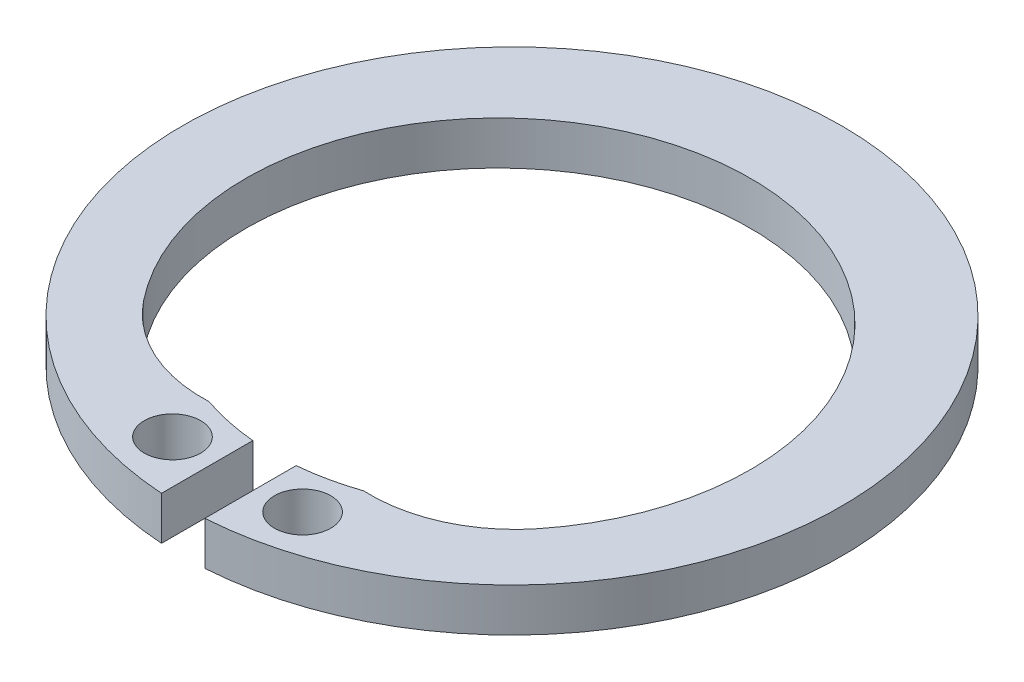
ISO-10303-21;
HEADER;
FILE_DESCRIPTION(('STEP AP214'),'2;1');
FILE_NAME('part.step','',(''),(''),'','','');
FILE_SCHEMA(('AUTOMOTIVE_DESIGN { 1 0 10303 214 1 1 1 1 }'));
ENDSEC;
DATA;
#1=APPLICATION_CONTEXT('core data for automotive mechanical design processes');
#2=APPLICATION_PROTOCOL_DEFINITION('international standard','automotive_design',2000,#1);
#3=PRODUCT_CONTEXT('',#1,'mechanical');
#4=PRODUCT('Part','Part','',(#3));
#5=PRODUCT_RELATED_PRODUCT_CATEGORY('part','',(#4));
#6=PRODUCT_DEFINITION_FORMATION('','',#4);
#7=PRODUCT_DEFINITION_CONTEXT('part definition',#1,'design');
#8=PRODUCT_DEFINITION('design','',#6,#7);
#9=PRODUCT_DEFINITION_SHAPE('','',#8);
#10=(LENGTH_UNIT() NAMED_UNIT(*) SI_UNIT(.MILLI.,.METRE.));
#11=(NAMED_UNIT(*) PLANE_ANGLE_UNIT() SI_UNIT($,.RADIAN.));
#12=(NAMED_UNIT(*) SI_UNIT($,.STERADIAN.) SOLID_ANGLE_UNIT());
#13=UNCERTAINTY_MEASURE_WITH_UNIT(LENGTH_MEASURE(1.E-05),#10,'distance_accuracy_value','');
#14=(GEOMETRIC_REPRESENTATION_CONTEXT(3) GLOBAL_UNCERTAINTY_ASSIGNED_CONTEXT((#13)) GLOBAL_UNIT_ASSIGNED_CONTEXT((#10,
#11,#12)) REPRESENTATION_CONTEXT('',''));
#15=CARTESIAN_POINT('',(0.,0.,0.));
#16=DIRECTION('',(0.,0.,1.));
#17=DIRECTION('',(1.,0.,0.));
#18=AXIS2_PLACEMENT_3D('',#15,#16,#17);
#19=CARTESIAN_POINT('',(0.,1.,0.));
#20=DIRECTION('',(0.,-1.,0.));
#21=DIRECTION('',(0.,0.,-1.));
#22=AXIS2_PLACEMENT_3D('',#19,#20,#21);
#23=PLANE('',#22);
#24=CARTESIAN_POINT('',(0.,1.,0.));
#25=DIRECTION('',(0.,1.,0.));
#26=DIRECTION('',(0.,0.,-1.));
#27=AXIS2_PLACEMENT_3D('',#24,#25,#26);
#28=CIRCLE('',#27,7.6);
#29=CARTESIAN_POINT('',(0.500000000000001,1.,7.58353479585872));
#30=VERTEX_POINT('',#29);
#31=CARTESIAN_POINT('',(-0.499999999999999,1.,7.58353479585872));
#32=VERTEX_POINT('',#31);
#33=EDGE_CURVE('E145',#30,#32,#28,.T.);
#34=ORIENTED_EDGE('',*,*,#33,.T.);
#35=DIRECTION('',(0.,0.,-1.));
#36=VECTOR('',#35,1.);
#37=CARTESIAN_POINT('',(-0.499999999999999,1.,7.58353479585872));
#38=LINE('',#37,#36);
#39=CARTESIAN_POINT('',(-0.499999999999999,1.,5.47722557505166));
#40=VERTEX_POINT('',#39);
#41=EDGE_CURVE('E93',#32,#40,#38,.T.);
#42=ORIENTED_EDGE('',*,*,#41,.T.);
#43=CARTESIAN_POINT('',(0.,1.,0.));
#44=DIRECTION('',(0.,-1.,0.));
#45=DIRECTION('',(0.,0.,-1.));
#46=AXIS2_PLACEMENT_3D('',#43,#44,#45);
#47=CIRCLE('',#46,5.5);
#48=CARTESIAN_POINT('',(-1.78055613261314,1.,5.20380820732411));
#49=VERTEX_POINT('',#48);
#50=EDGE_CURVE('E160',#40,#49,#47,.T.);
#51=ORIENTED_EDGE('',*,*,#50,.T.);
#52=CARTESIAN_POINT('',(-1.93130134611594,1.,1.85615336840999));
#53=DIRECTION('',(0.,-1.,0.));
#54=DIRECTION('',(0.,0.,1.));
#55=AXIS2_PLACEMENT_3D('',#52,#53,#54);
#56=CIRCLE('',#55,3.35104715572596);
#57=CARTESIAN_POINT('',(-4.5534080353056,1.,3.94279506031733));
#58=VERTEX_POINT('',#57);
#59=EDGE_CURVE('E173',#49,#58,#56,.T.);
#60=ORIENTED_EDGE('',*,*,#59,.T.);
#61=CARTESIAN_POINT('',(0.,1.,0.319246451137412));
#62=DIRECTION('',(0.,-1.,0.));
#63=DIRECTION('',(0.,0.,-1.));
#64=AXIS2_PLACEMENT_3D('',#61,#62,#63);
#65=CIRCLE('',#64,5.81924645113741);
#66=CARTESIAN_POINT('',(4.5534080353056,1.,3.94279506031733));
#67=VERTEX_POINT('',#66);
#68=EDGE_CURVE('E112',#58,#67,#65,.T.);
#69=ORIENTED_EDGE('',*,*,#68,.T.);
#70=CARTESIAN_POINT('',(1.93130134611594,1.,1.85615336840999));
#71=DIRECTION('',(0.,-1.,0.));
#72=DIRECTION('',(0.,0.,-1.));
#73=AXIS2_PLACEMENT_3D('',#70,#71,#72);
#74=CIRCLE('',#73,3.35104715572596);
#75=CARTESIAN_POINT('',(1.78055613261314,1.,5.20380820732411));
#76=VERTEX_POINT('',#75);
#77=EDGE_CURVE('E106',#67,#76,#74,.T.);
#78=ORIENTED_EDGE('',*,*,#77,.T.);
#79=CARTESIAN_POINT('',(0.,1.,0.));
#80=DIRECTION('',(0.,-1.,0.));
#81=DIRECTION('',(0.,0.,1.));
#82=AXIS2_PLACEMENT_3D('',#79,#80,#81);
#83=CIRCLE('',#82,5.5);
#84=CARTESIAN_POINT('',(0.5,1.,5.47722557505166));
#85=VERTEX_POINT('',#84);
#86=EDGE_CURVE('E110',#76,#85,#83,.T.);
#87=ORIENTED_EDGE('',*,*,#86,.T.);
#88=DIRECTION('',(0.,0.,1.));
#89=VECTOR('',#88,1.);
#90=CARTESIAN_POINT('',(0.500000000000001,1.,7.58353479585872));
#91=LINE('',#90,#89);
#92=EDGE_CURVE('E50',#85,#30,#91,.T.);
#93=ORIENTED_EDGE('',*,*,#92,.T.);
#94=EDGE_LOOP('',(#34,#42,#51,#60,#69,#78,#87,#93));
#95=FACE_BOUND('',#94,.T.);
#96=CARTESIAN_POINT('',(-1.5,1.,6.32958885700515));
#97=DIRECTION('',(0.,1.,0.));
#98=DIRECTION('',(0.,0.,1.));
#99=AXIS2_PLACEMENT_3D('',#96,#97,#98);
#100=CIRCLE('',#99,0.65);
#101=CARTESIAN_POINT('',(-1.5,1.,6.97958885700515));
#102=VERTEX_POINT('',#101);
#103=EDGE_CURVE('E134',#102,#102,#100,.T.);
#104=ORIENTED_EDGE('',*,*,#103,.F.);
#105=EDGE_LOOP('',(#104));
#106=FACE_BOUND('',#105,.T.);
#107=CARTESIAN_POINT('',(1.5,1.,6.32958885700515));
#108=DIRECTION('',(0.,1.,0.));
#109=DIRECTION('',(0.,0.,-1.));
#110=AXIS2_PLACEMENT_3D('',#107,#108,#109);
#111=CIRCLE('',#110,0.650000000000001);
#112=CARTESIAN_POINT('',(1.5,1.,5.67958885700515));
#113=VERTEX_POINT('',#112);
#114=EDGE_CURVE('E182',#113,#113,#111,.T.);
#115=ORIENTED_EDGE('',*,*,#114,.F.);
#116=EDGE_LOOP('',(#115));
#117=FACE_BOUND('',#116,.T.);
#118=ADVANCED_FACE('F33',(#95,#106,#117),#23,.F.);
#119=CARTESIAN_POINT('',(0.,0.,0.));
#120=DIRECTION('',(0.,-1.,0.));
#121=DIRECTION('',(0.,0.,-1.));
#122=AXIS2_PLACEMENT_3D('',#119,#120,#121);
#123=PLANE('',#122);
#124=CARTESIAN_POINT('',(-1.5,0.,6.32958885700515));
#125=DIRECTION('',(0.,1.,0.));
#126=DIRECTION('',(0.,0.,1.));
#127=AXIS2_PLACEMENT_3D('',#124,#125,#126);
#128=CIRCLE('',#127,0.65);
#129=CARTESIAN_POINT('',(-1.5,0.,6.97958885700515));
#130=VERTEX_POINT('',#129);
#131=EDGE_CURVE('E179',#130,#130,#128,.T.);
#132=ORIENTED_EDGE('',*,*,#131,.T.);
#133=EDGE_LOOP('',(#132));
#134=FACE_BOUND('',#133,.T.);
#135=CARTESIAN_POINT('',(0.,0.,0.));
#136=DIRECTION('',(0.,1.,0.));
#137=DIRECTION('',(0.,0.,-1.));
#138=AXIS2_PLACEMENT_3D('',#135,#136,#137);
#139=CIRCLE('',#138,7.6);
#140=CARTESIAN_POINT('',(0.500000000000001,0.,7.58353479585872));
#141=VERTEX_POINT('',#140);
#142=CARTESIAN_POINT('',(-0.499999999999999,0.,7.58353479585872));
#143=VERTEX_POINT('',#142);
#144=EDGE_CURVE('E130',#141,#143,#139,.T.);
#145=ORIENTED_EDGE('',*,*,#144,.F.);
#146=DIRECTION('',(0.,0.,1.));
#147=VECTOR('',#146,1.);
#148=CARTESIAN_POINT('',(0.500000000000001,0.,7.58353479585872));
#149=LINE('',#148,#147);
#150=CARTESIAN_POINT('',(0.5,0.,5.47722557505166));
#151=VERTEX_POINT('',#150);
#152=EDGE_CURVE('E85',#151,#141,#149,.T.);
#153=ORIENTED_EDGE('',*,*,#152,.F.);
#154=CARTESIAN_POINT('',(0.,0.,0.));
#155=DIRECTION('',(0.,-1.,0.));
#156=DIRECTION('',(0.,0.,1.));
#157=AXIS2_PLACEMENT_3D('',#154,#155,#156);
#158=CIRCLE('',#157,5.5);
#159=CARTESIAN_POINT('',(1.78055613261314,0.,5.20380820732411));
#160=VERTEX_POINT('',#159);
#161=EDGE_CURVE('E79',#160,#151,#158,.T.);
#162=ORIENTED_EDGE('',*,*,#161,.F.);
#163=CARTESIAN_POINT('',(1.93130134611594,0.,1.85615336840999));
#164=DIRECTION('',(0.,-1.,0.));
#165=DIRECTION('',(0.,0.,-1.));
#166=AXIS2_PLACEMENT_3D('',#163,#164,#165);
#167=CIRCLE('',#166,3.35104715572596);
#168=CARTESIAN_POINT('',(4.5534080353056,0.,3.94279506031733));
#169=VERTEX_POINT('',#168);
#170=EDGE_CURVE('E120',#169,#160,#167,.T.);
#171=ORIENTED_EDGE('',*,*,#170,.F.);
#172=CARTESIAN_POINT('',(0.,0.,0.319246451137412));
#173=DIRECTION('',(0.,-1.,0.));
#174=DIRECTION('',(0.,0.,-1.));
#175=AXIS2_PLACEMENT_3D('',#172,#173,#174);
#176=CIRCLE('',#175,5.81924645113741);
#177=CARTESIAN_POINT('',(-4.5534080353056,0.,3.94279506031733));
#178=VERTEX_POINT('',#177);
#179=EDGE_CURVE('E140',#178,#169,#176,.T.);
#180=ORIENTED_EDGE('',*,*,#179,.F.);
#181=CARTESIAN_POINT('',(-1.93130134611594,0.,1.85615336840999));
#182=DIRECTION('',(0.,-1.,0.));
#183=DIRECTION('',(0.,0.,1.));
#184=AXIS2_PLACEMENT_3D('',#181,#182,#183);
#185=CIRCLE('',#184,3.35104715572596);
#186=CARTESIAN_POINT('',(-1.78055613261314,0.,5.20380820732411));
#187=VERTEX_POINT('',#186);
#188=EDGE_CURVE('E138',#187,#178,#185,.T.);
#189=ORIENTED_EDGE('',*,*,#188,.F.);
#190=CARTESIAN_POINT('',(0.,0.,0.));
#191=DIRECTION('',(0.,-1.,0.));
#192=DIRECTION('',(0.,0.,-1.));
#193=AXIS2_PLACEMENT_3D('',#190,#191,#192);
#194=CIRCLE('',#193,5.5);
#195=CARTESIAN_POINT('',(-0.499999999999999,0.,5.47722557505166));
#196=VERTEX_POINT('',#195);
#197=EDGE_CURVE('E136',#196,#187,#194,.T.);
#198=ORIENTED_EDGE('',*,*,#197,.F.);
#199=DIRECTION('',(0.,0.,-1.));
#200=VECTOR('',#199,1.);
#201=CARTESIAN_POINT('',(-0.499999999999999,0.,7.58353479585872));
#202=LINE('',#201,#200);
#203=EDGE_CURVE('E133',#143,#196,#202,.T.);
#204=ORIENTED_EDGE('',*,*,#203,.F.);
#205=EDGE_LOOP('',(#145,#153,#162,#171,#180,#189,#198,#204));
#206=FACE_BOUND('',#205,.T.);
#207=CARTESIAN_POINT('',(1.5,0.,6.32958885700515));
#208=DIRECTION('',(0.,1.,0.));
#209=DIRECTION('',(0.,0.,-1.));
#210=AXIS2_PLACEMENT_3D('',#207,#208,#209);
#211=CIRCLE('',#210,0.650000000000001);
#212=CARTESIAN_POINT('',(1.5,0.,5.67958885700515));
#213=VERTEX_POINT('',#212);
#214=EDGE_CURVE('E185',#213,#213,#211,.T.);
#215=ORIENTED_EDGE('',*,*,#214,.T.);
#216=EDGE_LOOP('',(#215));
#217=FACE_BOUND('',#216,.T.);
#218=ADVANCED_FACE('F164',(#134,#206,#217),#123,.T.);
#219=CARTESIAN_POINT('',(0.,1.,0.));
#220=DIRECTION('',(0.,-1.,0.));
#221=DIRECTION('',(0.,0.,-1.));
#222=AXIS2_PLACEMENT_3D('',#219,#220,#221);
#223=CYLINDRICAL_SURFACE('',#222,7.6);
#224=ORIENTED_EDGE('',*,*,#144,.T.);
#225=DIRECTION('',(0.,-1.,0.));
#226=VECTOR('',#225,1.);
#227=CARTESIAN_POINT('',(-0.499999999999999,1.,7.58353479585872));
#228=LINE('',#227,#226);
#229=EDGE_CURVE('E11',#32,#143,#228,.T.);
#230=ORIENTED_EDGE('',*,*,#229,.F.);
#231=ORIENTED_EDGE('',*,*,#33,.F.);
#232=DIRECTION('',(0.,-1.,0.));
#233=VECTOR('',#232,1.);
#234=CARTESIAN_POINT('',(0.500000000000001,1.,7.58353479585872));
#235=LINE('',#234,#233);
#236=EDGE_CURVE('E126',#30,#141,#235,.T.);
#237=ORIENTED_EDGE('',*,*,#236,.T.);
#238=EDGE_LOOP('',(#224,#230,#231,#237));
#239=FACE_BOUND('',#238,.T.);
#240=ADVANCED_FACE('F35',(#239),#223,.T.);
#241=CARTESIAN_POINT('',(-0.499999999999999,1.,7.58353479585872));
#242=DIRECTION('',(-1.,0.,0.));
#243=DIRECTION('',(0.,0.,1.));
#244=AXIS2_PLACEMENT_3D('',#241,#242,#243);
#245=PLANE('',#244);
#246=ORIENTED_EDGE('',*,*,#203,.T.);
#247=DIRECTION('',(0.,-1.,0.));
#248=VECTOR('',#247,1.);
#249=CARTESIAN_POINT('',(-0.499999999999999,1.,5.47722557505166));
#250=LINE('',#249,#248);
#251=EDGE_CURVE('E42',#40,#196,#250,.T.);
#252=ORIENTED_EDGE('',*,*,#251,.F.);
#253=ORIENTED_EDGE('',*,*,#41,.F.);
#254=ORIENTED_EDGE('',*,*,#229,.T.);
#255=EDGE_LOOP('',(#246,#252,#253,#254));
#256=FACE_BOUND('',#255,.T.);
#257=ADVANCED_FACE('F217',(#256),#245,.F.);
#258=CARTESIAN_POINT('',(0.,1.,0.));
#259=DIRECTION('',(0.,-1.,0.));
#260=DIRECTION('',(0.,0.,-1.));
#261=AXIS2_PLACEMENT_3D('',#258,#259,#260);
#262=CYLINDRICAL_SURFACE('',#261,5.5);
#263=ORIENTED_EDGE('',*,*,#197,.T.);
#264=DIRECTION('',(0.,-1.,0.));
#265=VECTOR('',#264,1.);
#266=CARTESIAN_POINT('',(-1.78055613261314,1.,5.20380820732411));
#267=LINE('',#266,#265);
#268=EDGE_CURVE('E152',#49,#187,#267,.T.);
#269=ORIENTED_EDGE('',*,*,#268,.F.);
#270=ORIENTED_EDGE('',*,*,#50,.F.);
#271=ORIENTED_EDGE('',*,*,#251,.T.);
#272=EDGE_LOOP('',(#263,#269,#270,#271));
#273=FACE_BOUND('',#272,.T.);
#274=ADVANCED_FACE('F158',(#273),#262,.F.);
#275=CARTESIAN_POINT('',(-1.93130134611594,1.,1.85615336840999));
#276=DIRECTION('',(0.,-1.,0.));
#277=DIRECTION('',(0.,0.,-1.));
#278=AXIS2_PLACEMENT_3D('',#275,#276,#277);
#279=CYLINDRICAL_SURFACE('',#278,3.35104715572596);
#280=ORIENTED_EDGE('',*,*,#188,.T.);
#281=DIRECTION('',(0.,-1.,0.));
#282=VECTOR('',#281,1.);
#283=CARTESIAN_POINT('',(-4.5534080353056,1.,3.94279506031733));
#284=LINE('',#283,#282);
#285=EDGE_CURVE('E149',#58,#178,#284,.T.);
#286=ORIENTED_EDGE('',*,*,#285,.F.);
#287=ORIENTED_EDGE('',*,*,#59,.F.);
#288=ORIENTED_EDGE('',*,*,#268,.T.);
#289=EDGE_LOOP('',(#280,#286,#287,#288));
#290=FACE_BOUND('',#289,.T.);
#291=ADVANCED_FACE('F169',(#290),#279,.F.);
#292=CARTESIAN_POINT('',(0.,1.,0.319246451137412));
#293=DIRECTION('',(0.,-1.,0.));
#294=DIRECTION('',(0.,0.,-1.));
#295=AXIS2_PLACEMENT_3D('',#292,#293,#294);
#296=CYLINDRICAL_SURFACE('',#295,5.81924645113741);
#297=ORIENTED_EDGE('',*,*,#179,.T.);
#298=DIRECTION('',(0.,-1.,0.));
#299=VECTOR('',#298,1.);
#300=CARTESIAN_POINT('',(4.5534080353056,1.,3.94279506031733));
#301=LINE('',#300,#299);
#302=EDGE_CURVE('E121',#67,#169,#301,.T.);
#303=ORIENTED_EDGE('',*,*,#302,.F.);
#304=ORIENTED_EDGE('',*,*,#68,.F.);
#305=ORIENTED_EDGE('',*,*,#285,.T.);
#306=EDGE_LOOP('',(#297,#303,#304,#305));
#307=FACE_BOUND('',#306,.T.);
#308=ADVANCED_FACE('F172',(#307),#296,.F.);
#309=CARTESIAN_POINT('',(1.93130134611594,1.,1.85615336840999));
#310=DIRECTION('',(0.,-1.,0.));
#311=DIRECTION('',(0.,0.,-1.));
#312=AXIS2_PLACEMENT_3D('',#309,#310,#311);
#313=CYLINDRICAL_SURFACE('',#312,3.35104715572596);
#314=ORIENTED_EDGE('',*,*,#170,.T.);
#315=DIRECTION('',(0.,-1.,0.));
#316=VECTOR('',#315,1.);
#317=CARTESIAN_POINT('',(1.78055613261314,1.,5.20380820732411));
#318=LINE('',#317,#316);
#319=EDGE_CURVE('E117',#76,#160,#318,.T.);
#320=ORIENTED_EDGE('',*,*,#319,.F.);
#321=ORIENTED_EDGE('',*,*,#77,.F.);
#322=ORIENTED_EDGE('',*,*,#302,.T.);
#323=EDGE_LOOP('',(#314,#320,#321,#322));
#324=FACE_BOUND('',#323,.T.);
#325=ADVANCED_FACE('F118',(#324),#313,.F.);
#326=CARTESIAN_POINT('',(0.,1.,0.));
#327=DIRECTION('',(0.,-1.,0.));
#328=DIRECTION('',(0.,0.,-1.));
#329=AXIS2_PLACEMENT_3D('',#326,#327,#328);
#330=CYLINDRICAL_SURFACE('',#329,5.5);
#331=ORIENTED_EDGE('',*,*,#161,.T.);
#332=DIRECTION('',(0.,-1.,0.));
#333=VECTOR('',#332,1.);
#334=CARTESIAN_POINT('',(0.5,1.,5.47722557505166));
#335=LINE('',#334,#333);
#336=EDGE_CURVE('E122',#85,#151,#335,.T.);
#337=ORIENTED_EDGE('',*,*,#336,.F.);
#338=ORIENTED_EDGE('',*,*,#86,.F.);
#339=ORIENTED_EDGE('',*,*,#319,.T.);
#340=EDGE_LOOP('',(#331,#337,#338,#339));
#341=FACE_BOUND('',#340,.T.);
#342=ADVANCED_FACE('F124',(#341),#330,.F.);
#343=CARTESIAN_POINT('',(0.500000000000001,1.,7.58353479585872));
#344=DIRECTION('',(1.,0.,0.));
#345=DIRECTION('',(0.,0.,-1.));
#346=AXIS2_PLACEMENT_3D('',#343,#344,#345);
#347=PLANE('',#346);
#348=ORIENTED_EDGE('',*,*,#152,.T.);
#349=ORIENTED_EDGE('',*,*,#236,.F.);
#350=ORIENTED_EDGE('',*,*,#92,.F.);
#351=ORIENTED_EDGE('',*,*,#336,.T.);
#352=EDGE_LOOP('',(#348,#349,#350,#351));
#353=FACE_BOUND('',#352,.T.);
#354=ADVANCED_FACE('F205',(#353),#347,.F.);
#355=CARTESIAN_POINT('',(-1.5,1.,6.32958885700515));
#356=DIRECTION('',(0.,-1.,0.));
#357=DIRECTION('',(0.,0.,-1.));
#358=AXIS2_PLACEMENT_3D('',#355,#356,#357);
#359=CYLINDRICAL_SURFACE('',#358,0.65);
#360=ORIENTED_EDGE('',*,*,#103,.T.);
#361=EDGE_LOOP('',(#360));
#362=FACE_BOUND('',#361,.T.);
#363=ORIENTED_EDGE('',*,*,#131,.F.);
#364=EDGE_LOOP('',(#363));
#365=FACE_BOUND('',#364,.T.);
#366=ADVANCED_FACE('F202',(#362,#365),#359,.F.);
#367=CARTESIAN_POINT('',(1.5,1.,6.32958885700515));
#368=DIRECTION('',(0.,-1.,0.));
#369=DIRECTION('',(0.,0.,-1.));
#370=AXIS2_PLACEMENT_3D('',#367,#368,#369);
#371=CYLINDRICAL_SURFACE('',#370,0.650000000000001);
#372=ORIENTED_EDGE('',*,*,#114,.T.);
#373=EDGE_LOOP('',(#372));
#374=FACE_BOUND('',#373,.T.);
#375=ORIENTED_EDGE('',*,*,#214,.F.);
#376=EDGE_LOOP('',(#375));
#377=FACE_BOUND('',#376,.T.);
#378=ADVANCED_FACE('F191',(#374,#377),#371,.F.);
#379=CLOSED_SHELL('',(#118,#218,#240,#257,#274,#291,#308,#325,#342,#354,#366,#378));
#380=MANIFOLD_SOLID_BREP('B2',#379);
#381=ADVANCED_BREP_SHAPE_REPRESENTATION('',(#18,#380),#14);
#382=SHAPE_DEFINITION_REPRESENTATION(#9,#381);
ENDSEC;
END-ISO-10303-21;
